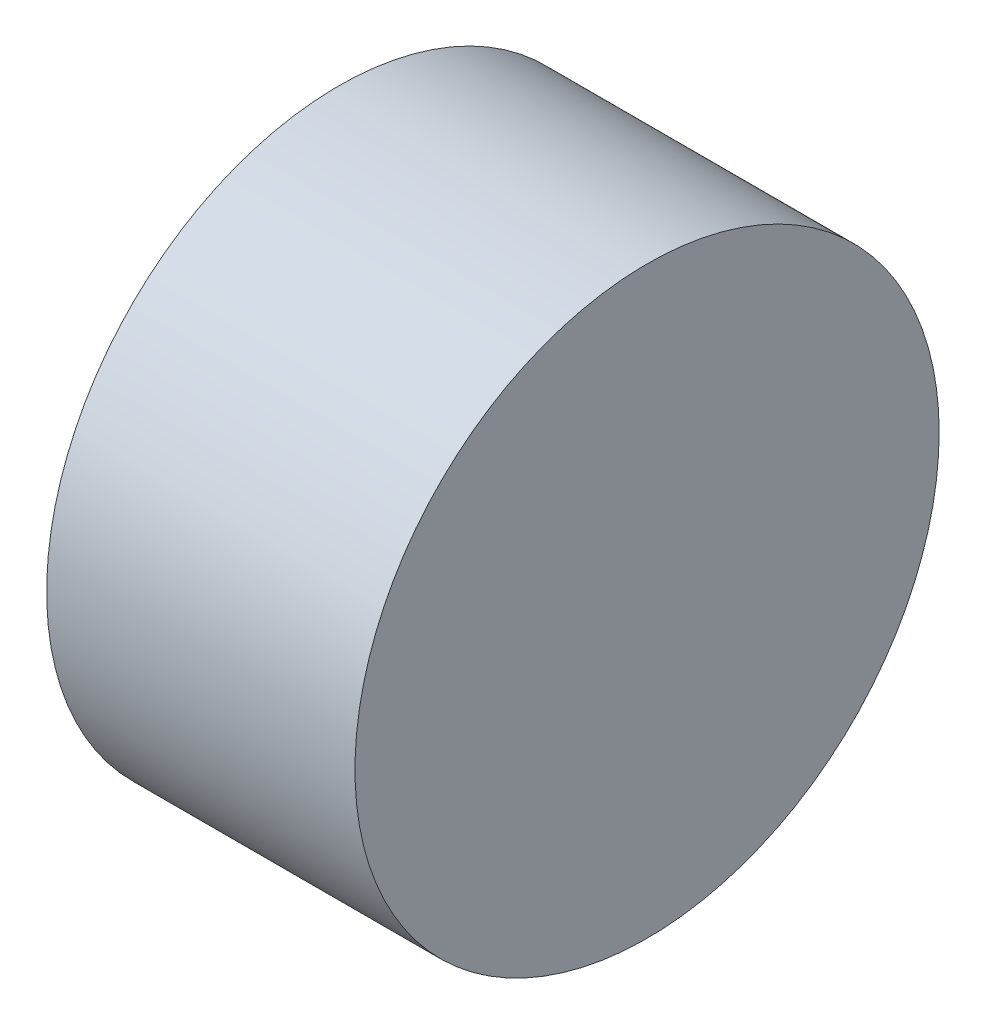
ISO-10303-21;
HEADER;
FILE_DESCRIPTION(('STEP AP214'),'2;1');
FILE_NAME('part.step','',(''),(''),'','','');
FILE_SCHEMA(('AUTOMOTIVE_DESIGN { 1 0 10303 214 1 1 1 1 }'));
ENDSEC;
DATA;
#1=APPLICATION_CONTEXT('core data for automotive mechanical design processes');
#2=APPLICATION_PROTOCOL_DEFINITION('international standard','automotive_design',2000,#1);
#3=PRODUCT_CONTEXT('',#1,'mechanical');
#4=PRODUCT('Part','Part','',(#3));
#5=PRODUCT_RELATED_PRODUCT_CATEGORY('part','',(#4));
#6=PRODUCT_DEFINITION_FORMATION('','',#4);
#7=PRODUCT_DEFINITION_CONTEXT('part definition',#1,'design');
#8=PRODUCT_DEFINITION('design','',#6,#7);
#9=PRODUCT_DEFINITION_SHAPE('','',#8);
#10=(LENGTH_UNIT() NAMED_UNIT(*) SI_UNIT(.MILLI.,.METRE.));
#11=(NAMED_UNIT(*) PLANE_ANGLE_UNIT() SI_UNIT($,.RADIAN.));
#12=(NAMED_UNIT(*) SI_UNIT($,.STERADIAN.) SOLID_ANGLE_UNIT());
#13=UNCERTAINTY_MEASURE_WITH_UNIT(LENGTH_MEASURE(1.E-05),#10,'distance_accuracy_value','');
#14=(GEOMETRIC_REPRESENTATION_CONTEXT(3) GLOBAL_UNCERTAINTY_ASSIGNED_CONTEXT((#13)) GLOBAL_UNIT_ASSIGNED_CONTEXT((#10,
#11,#12)) REPRESENTATION_CONTEXT('',''));
#15=CARTESIAN_POINT('',(0.,0.,0.));
#16=DIRECTION('',(0.,0.,1.));
#17=DIRECTION('',(1.,0.,0.));
#18=AXIS2_PLACEMENT_3D('',#15,#16,#17);
#19=CARTESIAN_POINT('',(38.,0.,0.));
#20=DIRECTION('',(-1.,0.,0.));
#21=DIRECTION('',(0.,0.,1.));
#22=AXIS2_PLACEMENT_3D('',#19,#20,#21);
#23=CYLINDRICAL_SURFACE('',#22,36.);
#24=CARTESIAN_POINT('',(38.,0.,0.));
#25=DIRECTION('',(1.,0.,0.));
#26=DIRECTION('',(0.,0.,-1.));
#27=AXIS2_PLACEMENT_3D('',#24,#25,#26);
#28=CIRCLE('',#27,36.);
#29=CARTESIAN_POINT('',(38.,0.,-36.));
#30=VERTEX_POINT('',#29);
#31=EDGE_CURVE('E10',#30,#30,#28,.T.);
#32=ORIENTED_EDGE('',*,*,#31,.F.);
#33=EDGE_LOOP('',(#32));
#34=FACE_BOUND('',#33,.T.);
#35=CARTESIAN_POINT('',(0.,0.,0.));
#36=DIRECTION('',(1.,0.,0.));
#37=DIRECTION('',(0.,0.,-1.));
#38=AXIS2_PLACEMENT_3D('',#35,#36,#37);
#39=CIRCLE('',#38,36.);
#40=CARTESIAN_POINT('',(0.,0.,-36.));
#41=VERTEX_POINT('',#40);
#42=EDGE_CURVE('E34',#41,#41,#39,.T.);
#43=ORIENTED_EDGE('',*,*,#42,.T.);
#44=EDGE_LOOP('',(#43));
#45=FACE_BOUND('',#44,.T.);
#46=ADVANCED_FACE('F31',(#34,#45),#23,.T.);
#47=CARTESIAN_POINT('',(38.,0.,0.));
#48=DIRECTION('',(1.,0.,0.));
#49=DIRECTION('',(0.,0.,-1.));
#50=AXIS2_PLACEMENT_3D('',#47,#48,#49);
#51=PLANE('',#50);
#52=ORIENTED_EDGE('',*,*,#31,.T.);
#53=EDGE_LOOP('',(#52));
#54=FACE_BOUND('',#53,.T.);
#55=ADVANCED_FACE('F46',(#54),#51,.T.);
#56=CARTESIAN_POINT('',(0.,0.,0.));
#57=DIRECTION('',(1.,0.,0.));
#58=DIRECTION('',(0.,0.,-1.));
#59=AXIS2_PLACEMENT_3D('',#56,#57,#58);
#60=PLANE('',#59);
#61=ORIENTED_EDGE('',*,*,#42,.F.);
#62=EDGE_LOOP('',(#61));
#63=FACE_BOUND('',#62,.T.);
#64=ADVANCED_FACE('F44',(#63),#60,.F.);
#65=CLOSED_SHELL('',(#46,#55,#64));
#66=MANIFOLD_SOLID_BREP('B2',#65);
#67=ADVANCED_BREP_SHAPE_REPRESENTATION('',(#18,#66),#14);
#68=SHAPE_DEFINITION_REPRESENTATION(#9,#67);
ENDSEC;
END-ISO-10303-21;
